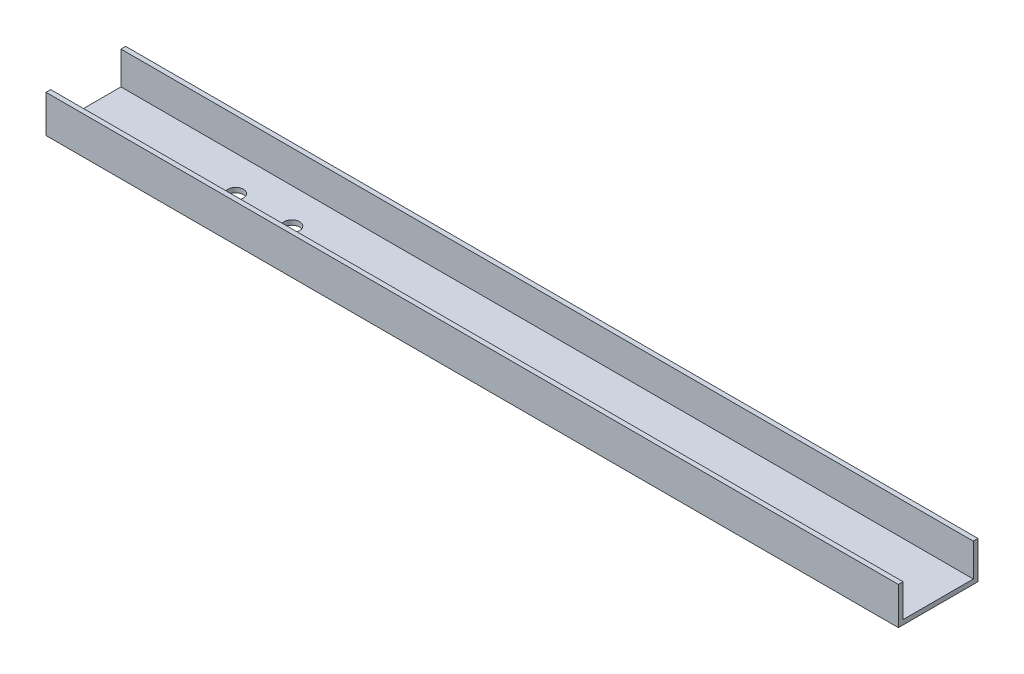
ISO-10303-21;
HEADER;
FILE_DESCRIPTION(('STEP AP214'),'2;1');
FILE_NAME('part.step','',(''),(''),'','','');
FILE_SCHEMA(('AUTOMOTIVE_DESIGN { 1 0 10303 214 1 1 1 1 }'));
ENDSEC;
DATA;
#1=APPLICATION_CONTEXT('core data for automotive mechanical design processes');
#2=APPLICATION_PROTOCOL_DEFINITION('international standard','automotive_design',2000,#1);
#3=PRODUCT_CONTEXT('',#1,'mechanical');
#4=PRODUCT('Part','Part','',(#3));
#5=PRODUCT_RELATED_PRODUCT_CATEGORY('part','',(#4));
#6=PRODUCT_DEFINITION_FORMATION('','',#4);
#7=PRODUCT_DEFINITION_CONTEXT('part definition',#1,'design');
#8=PRODUCT_DEFINITION('design','',#6,#7);
#9=PRODUCT_DEFINITION_SHAPE('','',#8);
#10=(LENGTH_UNIT() NAMED_UNIT(*) SI_UNIT(.MILLI.,.METRE.));
#11=(NAMED_UNIT(*) PLANE_ANGLE_UNIT() SI_UNIT($,.RADIAN.));
#12=(NAMED_UNIT(*) SI_UNIT($,.STERADIAN.) SOLID_ANGLE_UNIT());
#13=UNCERTAINTY_MEASURE_WITH_UNIT(LENGTH_MEASURE(1.E-05),#10,'distance_accuracy_value','');
#14=(GEOMETRIC_REPRESENTATION_CONTEXT(3) GLOBAL_UNCERTAINTY_ASSIGNED_CONTEXT((#13)) GLOBAL_UNIT_ASSIGNED_CONTEXT((#10,
#11,#12)) REPRESENTATION_CONTEXT('',''));
#15=CARTESIAN_POINT('',(0.,0.,0.));
#16=DIRECTION('',(0.,0.,1.));
#17=DIRECTION('',(1.,0.,0.));
#18=AXIS2_PLACEMENT_3D('',#15,#16,#17);
#19=CARTESIAN_POINT('',(0.,1.,0.));
#20=DIRECTION('',(0.,1.,0.));
#21=DIRECTION('',(0.,0.,1.));
#22=AXIS2_PLACEMENT_3D('',#19,#20,#21);
#23=PLANE('',#22);
#24=CARTESIAN_POINT('',(-59.,1.,0.));
#25=DIRECTION('',(0.,1.,0.));
#26=DIRECTION('',(0.,0.,1.));
#27=AXIS2_PLACEMENT_3D('',#24,#25,#26);
#28=CIRCLE('',#27,1.65);
#29=CARTESIAN_POINT('',(-59.,1.,1.65));
#30=VERTEX_POINT('',#29);
#31=EDGE_CURVE('E311',#30,#30,#28,.T.);
#32=ORIENTED_EDGE('',*,*,#31,.F.);
#33=EDGE_LOOP('',(#32));
#34=FACE_BOUND('',#33,.T.);
#35=CARTESIAN_POINT('',(-47.,1.,0.));
#36=DIRECTION('',(0.,1.,0.));
#37=DIRECTION('',(0.,0.,1.));
#38=AXIS2_PLACEMENT_3D('',#35,#36,#37);
#39=CIRCLE('',#38,1.65);
#40=CARTESIAN_POINT('',(-47.,1.,1.65));
#41=VERTEX_POINT('',#40);
#42=EDGE_CURVE('E120',#41,#41,#39,.T.);
#43=ORIENTED_EDGE('',*,*,#42,.F.);
#44=EDGE_LOOP('',(#43));
#45=FACE_BOUND('',#44,.T.);
#46=DIRECTION('',(0.,0.,1.));
#47=VECTOR('',#46,1.);
#48=CARTESIAN_POINT('',(-91.,1.,0.));
#49=LINE('',#48,#47);
#50=CARTESIAN_POINT('',(-91.,1.,-7.5));
#51=VERTEX_POINT('',#50);
#52=CARTESIAN_POINT('',(-91.,1.,7.5));
#53=VERTEX_POINT('',#52);
#54=EDGE_CURVE('E56',#51,#53,#49,.T.);
#55=ORIENTED_EDGE('',*,*,#54,.T.);
#56=DIRECTION('',(-1.,0.,0.));
#57=VECTOR('',#56,1.);
#58=CARTESIAN_POINT('',(-91.,1.,7.5));
#59=LINE('',#58,#57);
#60=CARTESIAN_POINT('',(91.,1.,7.5));
#61=VERTEX_POINT('',#60);
#62=EDGE_CURVE('E51',#61,#53,#59,.T.);
#63=ORIENTED_EDGE('',*,*,#62,.F.);
#64=DIRECTION('',(0.,0.,1.));
#65=VECTOR('',#64,1.);
#66=CARTESIAN_POINT('',(91.,1.,0.));
#67=LINE('',#66,#65);
#68=CARTESIAN_POINT('',(91.,1.,-7.5));
#69=VERTEX_POINT('',#68);
#70=EDGE_CURVE('E151',#69,#61,#67,.T.);
#71=ORIENTED_EDGE('',*,*,#70,.F.);
#72=DIRECTION('',(1.,0.,0.));
#73=VECTOR('',#72,1.);
#74=CARTESIAN_POINT('',(-91.,1.,-7.5));
#75=LINE('',#74,#73);
#76=EDGE_CURVE('E131',#51,#69,#75,.T.);
#77=ORIENTED_EDGE('',*,*,#76,.F.);
#78=EDGE_LOOP('',(#55,#63,#71,#77));
#79=FACE_BOUND('',#78,.T.);
#80=ADVANCED_FACE('F36',(#34,#45,#79),#23,.T.);
#81=CARTESIAN_POINT('',(0.,1.,8.5));
#82=DIRECTION('',(0.,0.,1.));
#83=DIRECTION('',(1.,0.,0.));
#84=AXIS2_PLACEMENT_3D('',#81,#82,#83);
#85=PLANE('',#84);
#86=DIRECTION('',(-1.,0.,0.));
#87=VECTOR('',#86,1.);
#88=CARTESIAN_POINT('',(0.,0.,8.5));
#89=LINE('',#88,#87);
#90=CARTESIAN_POINT('',(91.,0.,8.5));
#91=VERTEX_POINT('',#90);
#92=CARTESIAN_POINT('',(-91.,0.,8.5));
#93=VERTEX_POINT('',#92);
#94=EDGE_CURVE('E102',#91,#93,#89,.T.);
#95=ORIENTED_EDGE('',*,*,#94,.F.);
#96=DIRECTION('',(0.,-1.,0.));
#97=VECTOR('',#96,1.);
#98=CARTESIAN_POINT('',(91.,1.,8.5));
#99=LINE('',#98,#97);
#100=CARTESIAN_POINT('',(91.,8.,8.5));
#101=VERTEX_POINT('',#100);
#102=EDGE_CURVE('E11',#101,#91,#99,.T.);
#103=ORIENTED_EDGE('',*,*,#102,.F.);
#104=DIRECTION('',(1.,0.,0.));
#105=VECTOR('',#104,1.);
#106=CARTESIAN_POINT('',(-91.,8.,8.5));
#107=LINE('',#106,#105);
#108=CARTESIAN_POINT('',(-91.,8.,8.5));
#109=VERTEX_POINT('',#108);
#110=EDGE_CURVE('E100',#109,#101,#107,.T.);
#111=ORIENTED_EDGE('',*,*,#110,.F.);
#112=DIRECTION('',(0.,-1.,0.));
#113=VECTOR('',#112,1.);
#114=CARTESIAN_POINT('',(-91.,1.,8.5));
#115=LINE('',#114,#113);
#116=EDGE_CURVE('E155',#109,#93,#115,.T.);
#117=ORIENTED_EDGE('',*,*,#116,.T.);
#118=EDGE_LOOP('',(#95,#103,#111,#117));
#119=FACE_BOUND('',#118,.T.);
#120=ADVANCED_FACE('F38',(#119),#85,.T.);
#121=CARTESIAN_POINT('',(91.,1.,0.));
#122=DIRECTION('',(1.,0.,0.));
#123=DIRECTION('',(0.,0.,-1.));
#124=AXIS2_PLACEMENT_3D('',#121,#122,#123);
#125=PLANE('',#124);
#126=DIRECTION('',(0.,0.,1.));
#127=VECTOR('',#126,1.);
#128=CARTESIAN_POINT('',(91.,0.,0.));
#129=LINE('',#128,#127);
#130=CARTESIAN_POINT('',(91.,0.,-8.5));
#131=VERTEX_POINT('',#130);
#132=EDGE_CURVE('E157',#131,#91,#129,.T.);
#133=ORIENTED_EDGE('',*,*,#132,.F.);
#134=DIRECTION('',(0.,-1.,0.));
#135=VECTOR('',#134,1.);
#136=CARTESIAN_POINT('',(91.,1.,-8.5));
#137=LINE('',#136,#135);
#138=CARTESIAN_POINT('',(91.,8.,-8.5));
#139=VERTEX_POINT('',#138);
#140=EDGE_CURVE('E44',#139,#131,#137,.T.);
#141=ORIENTED_EDGE('',*,*,#140,.F.);
#142=DIRECTION('',(0.,0.,-1.));
#143=VECTOR('',#142,1.);
#144=CARTESIAN_POINT('',(91.,8.,-8.5));
#145=LINE('',#144,#143);
#146=CARTESIAN_POINT('',(91.,8.,-7.5));
#147=VERTEX_POINT('',#146);
#148=EDGE_CURVE('E137',#147,#139,#145,.T.);
#149=ORIENTED_EDGE('',*,*,#148,.F.);
#150=DIRECTION('',(0.,-1.,0.));
#151=VECTOR('',#150,1.);
#152=CARTESIAN_POINT('',(91.,8.,-7.5));
#153=LINE('',#152,#151);
#154=EDGE_CURVE('E143',#147,#69,#153,.T.);
#155=ORIENTED_EDGE('',*,*,#154,.T.);
#156=ORIENTED_EDGE('',*,*,#70,.T.);
#157=DIRECTION('',(0.,-1.,0.));
#158=VECTOR('',#157,1.);
#159=CARTESIAN_POINT('',(91.,8.,7.5));
#160=LINE('',#159,#158);
#161=CARTESIAN_POINT('',(91.,8.,7.5));
#162=VERTEX_POINT('',#161);
#163=EDGE_CURVE('E110',#162,#61,#160,.T.);
#164=ORIENTED_EDGE('',*,*,#163,.F.);
#165=DIRECTION('',(0.,0.,-1.));
#166=VECTOR('',#165,1.);
#167=CARTESIAN_POINT('',(91.,8.,8.5));
#168=LINE('',#167,#166);
#169=EDGE_CURVE('E107',#101,#162,#168,.T.);
#170=ORIENTED_EDGE('',*,*,#169,.F.);
#171=ORIENTED_EDGE('',*,*,#102,.T.);
#172=EDGE_LOOP('',(#133,#141,#149,#155,#156,#164,#170,#171));
#173=FACE_BOUND('',#172,.T.);
#174=ADVANCED_FACE('F108',(#173),#125,.T.);
#175=CARTESIAN_POINT('',(0.,1.,-8.5));
#176=DIRECTION('',(0.,0.,-1.));
#177=DIRECTION('',(-1.,0.,0.));
#178=AXIS2_PLACEMENT_3D('',#175,#176,#177);
#179=PLANE('',#178);
#180=DIRECTION('',(1.,0.,0.));
#181=VECTOR('',#180,1.);
#182=CARTESIAN_POINT('',(0.,0.,-8.5));
#183=LINE('',#182,#181);
#184=CARTESIAN_POINT('',(-91.,0.,-8.5));
#185=VERTEX_POINT('',#184);
#186=EDGE_CURVE('E159',#185,#131,#183,.T.);
#187=ORIENTED_EDGE('',*,*,#186,.F.);
#188=DIRECTION('',(0.,-1.,0.));
#189=VECTOR('',#188,1.);
#190=CARTESIAN_POINT('',(-91.,1.,-8.5));
#191=LINE('',#190,#189);
#192=CARTESIAN_POINT('',(-91.,8.,-8.5));
#193=VERTEX_POINT('',#192);
#194=EDGE_CURVE('E165',#193,#185,#191,.T.);
#195=ORIENTED_EDGE('',*,*,#194,.F.);
#196=DIRECTION('',(-1.,0.,0.));
#197=VECTOR('',#196,1.);
#198=CARTESIAN_POINT('',(-91.,8.,-8.5));
#199=LINE('',#198,#197);
#200=EDGE_CURVE('E140',#139,#193,#199,.T.);
#201=ORIENTED_EDGE('',*,*,#200,.F.);
#202=ORIENTED_EDGE('',*,*,#140,.T.);
#203=EDGE_LOOP('',(#187,#195,#201,#202));
#204=FACE_BOUND('',#203,.T.);
#205=ADVANCED_FACE('F169',(#204),#179,.T.);
#206=CARTESIAN_POINT('',(-91.,1.,0.));
#207=DIRECTION('',(1.,0.,0.));
#208=DIRECTION('',(0.,0.,-1.));
#209=AXIS2_PLACEMENT_3D('',#206,#207,#208);
#210=PLANE('',#209);
#211=DIRECTION('',(0.,0.,1.));
#212=VECTOR('',#211,1.);
#213=CARTESIAN_POINT('',(-91.,0.,0.));
#214=LINE('',#213,#212);
#215=EDGE_CURVE('E153',#185,#93,#214,.T.);
#216=ORIENTED_EDGE('',*,*,#215,.T.);
#217=ORIENTED_EDGE('',*,*,#116,.F.);
#218=DIRECTION('',(0.,0.,1.));
#219=VECTOR('',#218,1.);
#220=CARTESIAN_POINT('',(-91.,8.,8.5));
#221=LINE('',#220,#219);
#222=CARTESIAN_POINT('',(-91.,8.,7.5));
#223=VERTEX_POINT('',#222);
#224=EDGE_CURVE('E118',#223,#109,#221,.T.);
#225=ORIENTED_EDGE('',*,*,#224,.F.);
#226=DIRECTION('',(0.,-1.,0.));
#227=VECTOR('',#226,1.);
#228=CARTESIAN_POINT('',(-91.,8.,7.5));
#229=LINE('',#228,#227);
#230=EDGE_CURVE('E126',#223,#53,#229,.T.);
#231=ORIENTED_EDGE('',*,*,#230,.T.);
#232=ORIENTED_EDGE('',*,*,#54,.F.);
#233=DIRECTION('',(0.,-1.,0.));
#234=VECTOR('',#233,1.);
#235=CARTESIAN_POINT('',(-91.,8.,-7.5));
#236=LINE('',#235,#234);
#237=CARTESIAN_POINT('',(-91.,8.,-7.5));
#238=VERTEX_POINT('',#237);
#239=EDGE_CURVE('E148',#238,#51,#236,.T.);
#240=ORIENTED_EDGE('',*,*,#239,.F.);
#241=DIRECTION('',(0.,0.,1.));
#242=VECTOR('',#241,1.);
#243=CARTESIAN_POINT('',(-91.,8.,-8.5));
#244=LINE('',#243,#242);
#245=EDGE_CURVE('E132',#193,#238,#244,.T.);
#246=ORIENTED_EDGE('',*,*,#245,.F.);
#247=ORIENTED_EDGE('',*,*,#194,.T.);
#248=EDGE_LOOP('',(#216,#217,#225,#231,#232,#240,#246,#247));
#249=FACE_BOUND('',#248,.T.);
#250=ADVANCED_FACE('F175',(#249),#210,.F.);
#251=CARTESIAN_POINT('',(0.,0.,0.));
#252=DIRECTION('',(0.,1.,0.));
#253=DIRECTION('',(0.,0.,1.));
#254=AXIS2_PLACEMENT_3D('',#251,#252,#253);
#255=PLANE('',#254);
#256=CARTESIAN_POINT('',(-59.,0.,0.));
#257=DIRECTION('',(0.,1.,0.));
#258=DIRECTION('',(0.,0.,1.));
#259=AXIS2_PLACEMENT_3D('',#256,#257,#258);
#260=CIRCLE('',#259,1.65);
#261=CARTESIAN_POINT('',(-59.,0.,1.65));
#262=VERTEX_POINT('',#261);
#263=EDGE_CURVE('E309',#262,#262,#260,.T.);
#264=ORIENTED_EDGE('',*,*,#263,.T.);
#265=EDGE_LOOP('',(#264));
#266=FACE_BOUND('',#265,.T.);
#267=CARTESIAN_POINT('',(-47.,0.,0.));
#268=DIRECTION('',(0.,1.,0.));
#269=DIRECTION('',(0.,0.,1.));
#270=AXIS2_PLACEMENT_3D('',#267,#268,#269);
#271=CIRCLE('',#270,1.65);
#272=CARTESIAN_POINT('',(-47.,0.,1.65));
#273=VERTEX_POINT('',#272);
#274=EDGE_CURVE('E312',#273,#273,#271,.T.);
#275=ORIENTED_EDGE('',*,*,#274,.T.);
#276=EDGE_LOOP('',(#275));
#277=FACE_BOUND('',#276,.T.);
#278=ORIENTED_EDGE('',*,*,#94,.T.);
#279=ORIENTED_EDGE('',*,*,#215,.F.);
#280=ORIENTED_EDGE('',*,*,#186,.T.);
#281=ORIENTED_EDGE('',*,*,#132,.T.);
#282=EDGE_LOOP('',(#278,#279,#280,#281));
#283=FACE_BOUND('',#282,.T.);
#284=ADVANCED_FACE('F173',(#266,#277,#283),#255,.F.);
#285=CARTESIAN_POINT('',(-91.,8.,-7.5));
#286=DIRECTION('',(0.,0.,-1.));
#287=DIRECTION('',(-1.,0.,0.));
#288=AXIS2_PLACEMENT_3D('',#285,#286,#287);
#289=PLANE('',#288);
#290=ORIENTED_EDGE('',*,*,#76,.T.);
#291=ORIENTED_EDGE('',*,*,#154,.F.);
#292=DIRECTION('',(1.,0.,0.));
#293=VECTOR('',#292,1.);
#294=CARTESIAN_POINT('',(-91.,8.,-7.5));
#295=LINE('',#294,#293);
#296=EDGE_CURVE('E135',#238,#147,#295,.T.);
#297=ORIENTED_EDGE('',*,*,#296,.F.);
#298=ORIENTED_EDGE('',*,*,#239,.T.);
#299=EDGE_LOOP('',(#290,#291,#297,#298));
#300=FACE_BOUND('',#299,.T.);
#301=ADVANCED_FACE('F182',(#300),#289,.F.);
#302=CARTESIAN_POINT('',(0.,8.,0.));
#303=DIRECTION('',(0.,1.,0.));
#304=DIRECTION('',(0.,0.,1.));
#305=AXIS2_PLACEMENT_3D('',#302,#303,#304);
#306=PLANE('',#305);
#307=ORIENTED_EDGE('',*,*,#245,.T.);
#308=ORIENTED_EDGE('',*,*,#296,.T.);
#309=ORIENTED_EDGE('',*,*,#148,.T.);
#310=ORIENTED_EDGE('',*,*,#200,.T.);
#311=EDGE_LOOP('',(#307,#308,#309,#310));
#312=FACE_BOUND('',#311,.T.);
#313=ADVANCED_FACE('F179',(#312),#306,.T.);
#314=CARTESIAN_POINT('',(-91.,8.,7.5));
#315=DIRECTION('',(0.,0.,1.));
#316=DIRECTION('',(1.,0.,0.));
#317=AXIS2_PLACEMENT_3D('',#314,#315,#316);
#318=PLANE('',#317);
#319=ORIENTED_EDGE('',*,*,#62,.T.);
#320=ORIENTED_EDGE('',*,*,#230,.F.);
#321=DIRECTION('',(-1.,0.,0.));
#322=VECTOR('',#321,1.);
#323=CARTESIAN_POINT('',(-91.,8.,7.5));
#324=LINE('',#323,#322);
#325=EDGE_CURVE('E113',#162,#223,#324,.T.);
#326=ORIENTED_EDGE('',*,*,#325,.F.);
#327=ORIENTED_EDGE('',*,*,#163,.T.);
#328=EDGE_LOOP('',(#319,#320,#326,#327));
#329=FACE_BOUND('',#328,.T.);
#330=ADVANCED_FACE('F185',(#329),#318,.F.);
#331=CARTESIAN_POINT('',(0.,8.,0.));
#332=DIRECTION('',(0.,1.,0.));
#333=DIRECTION('',(0.,0.,1.));
#334=AXIS2_PLACEMENT_3D('',#331,#332,#333);
#335=PLANE('',#334);
#336=ORIENTED_EDGE('',*,*,#110,.T.);
#337=ORIENTED_EDGE('',*,*,#169,.T.);
#338=ORIENTED_EDGE('',*,*,#325,.T.);
#339=ORIENTED_EDGE('',*,*,#224,.T.);
#340=EDGE_LOOP('',(#336,#337,#338,#339));
#341=FACE_BOUND('',#340,.T.);
#342=ADVANCED_FACE('F116',(#341),#335,.T.);
#343=CARTESIAN_POINT('',(-47.,1.,0.));
#344=DIRECTION('',(0.,1.,0.));
#345=DIRECTION('',(0.,0.,1.));
#346=AXIS2_PLACEMENT_3D('',#343,#344,#345);
#347=CYLINDRICAL_SURFACE('',#346,1.65);
#348=ORIENTED_EDGE('',*,*,#274,.F.);
#349=EDGE_LOOP('',(#348));
#350=FACE_BOUND('',#349,.T.);
#351=ORIENTED_EDGE('',*,*,#42,.T.);
#352=EDGE_LOOP('',(#351));
#353=FACE_BOUND('',#352,.T.);
#354=ADVANCED_FACE('F192',(#350,#353),#347,.F.);
#355=CARTESIAN_POINT('',(-59.,1.,0.));
#356=DIRECTION('',(0.,1.,0.));
#357=DIRECTION('',(0.,0.,1.));
#358=AXIS2_PLACEMENT_3D('',#355,#356,#357);
#359=CYLINDRICAL_SURFACE('',#358,1.65);
#360=ORIENTED_EDGE('',*,*,#263,.F.);
#361=EDGE_LOOP('',(#360));
#362=FACE_BOUND('',#361,.T.);
#363=ORIENTED_EDGE('',*,*,#31,.T.);
#364=EDGE_LOOP('',(#363));
#365=FACE_BOUND('',#364,.T.);
#366=ADVANCED_FACE('F292',(#362,#365),#359,.F.);
#367=CLOSED_SHELL('',(#80,#120,#174,#205,#250,#284,#301,#313,#330,#342,#354,#366));
#368=MANIFOLD_SOLID_BREP('B2',#367);
#369=ADVANCED_BREP_SHAPE_REPRESENTATION('',(#18,#368),#14);
#370=SHAPE_DEFINITION_REPRESENTATION(#9,#369);
ENDSEC;
END-ISO-10303-21;
